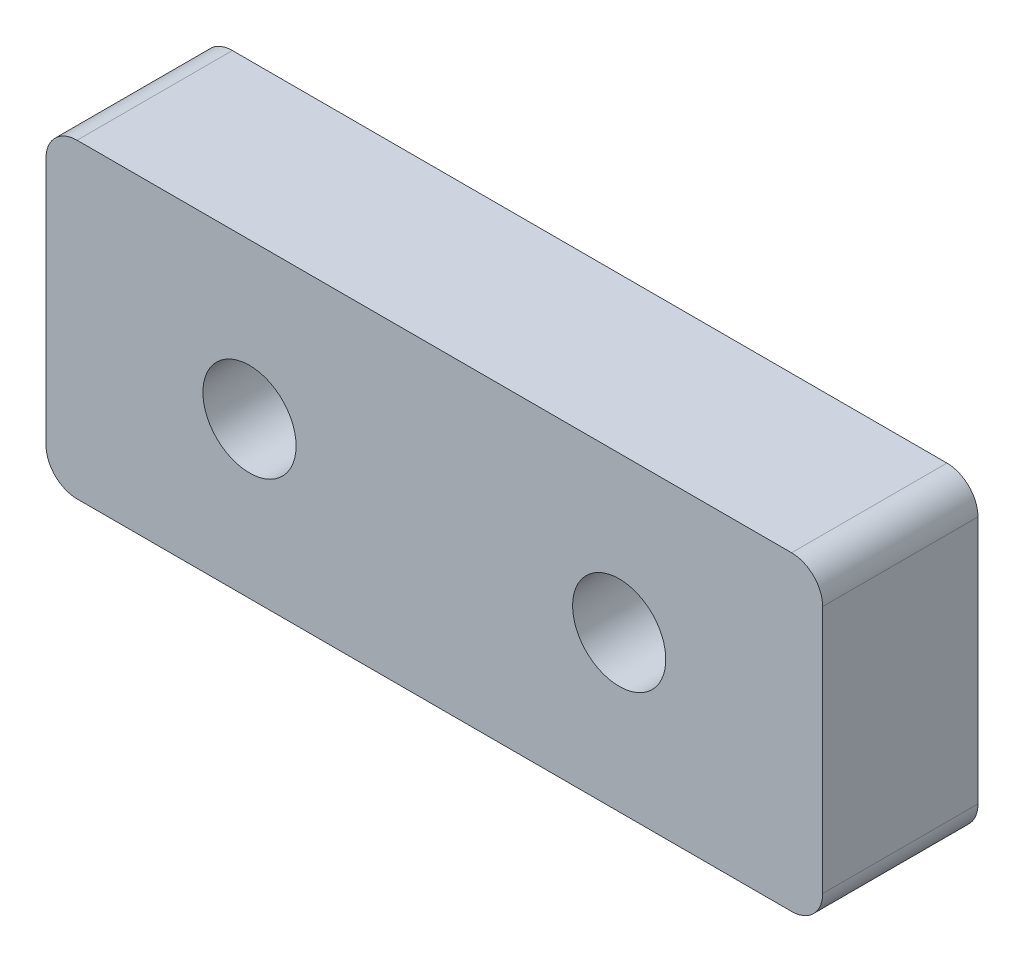
ISO-10303-21;
HEADER;
FILE_DESCRIPTION(('STEP AP214'),'2;1');
FILE_NAME('part.step','',(''),(''),'','','');
FILE_SCHEMA(('AUTOMOTIVE_DESIGN { 1 0 10303 214 1 1 1 1 }'));
ENDSEC;
DATA;
#1=APPLICATION_CONTEXT('core data for automotive mechanical design processes');
#2=APPLICATION_PROTOCOL_DEFINITION('international standard','automotive_design',2000,#1);
#3=PRODUCT_CONTEXT('',#1,'mechanical');
#4=PRODUCT('Part','Part','',(#3));
#5=PRODUCT_RELATED_PRODUCT_CATEGORY('part','',(#4));
#6=PRODUCT_DEFINITION_FORMATION('','',#4);
#7=PRODUCT_DEFINITION_CONTEXT('part definition',#1,'design');
#8=PRODUCT_DEFINITION('design','',#6,#7);
#9=PRODUCT_DEFINITION_SHAPE('','',#8);
#10=(LENGTH_UNIT() NAMED_UNIT(*) SI_UNIT(.MILLI.,.METRE.));
#11=(NAMED_UNIT(*) PLANE_ANGLE_UNIT() SI_UNIT($,.RADIAN.));
#12=(NAMED_UNIT(*) SI_UNIT($,.STERADIAN.) SOLID_ANGLE_UNIT());
#13=UNCERTAINTY_MEASURE_WITH_UNIT(LENGTH_MEASURE(1.E-05),#10,'distance_accuracy_value','');
#14=(GEOMETRIC_REPRESENTATION_CONTEXT(3) GLOBAL_UNCERTAINTY_ASSIGNED_CONTEXT((#13)) GLOBAL_UNIT_ASSIGNED_CONTEXT((#10,
#11,#12)) REPRESENTATION_CONTEXT('',''));
#15=CARTESIAN_POINT('',(0.,0.,0.));
#16=DIRECTION('',(0.,0.,1.));
#17=DIRECTION('',(1.,0.,0.));
#18=AXIS2_PLACEMENT_3D('',#15,#16,#17);
#19=CARTESIAN_POINT('',(0.,0.,5.));
#20=DIRECTION('',(0.,0.,-1.));
#21=DIRECTION('',(-1.,0.,0.));
#22=AXIS2_PLACEMENT_3D('',#19,#20,#21);
#23=PLANE('',#22);
#24=DIRECTION('',(0.,1.,0.));
#25=VECTOR('',#24,1.);
#26=CARTESIAN_POINT('',(12.5,-5.,5.));
#27=LINE('',#26,#25);
#28=CARTESIAN_POINT('',(12.5,-4.,5.));
#29=VERTEX_POINT('',#28);
#30=CARTESIAN_POINT('',(12.5,4.,5.));
#31=VERTEX_POINT('',#30);
#32=EDGE_CURVE('E142',#29,#31,#27,.T.);
#33=ORIENTED_EDGE('',*,*,#32,.T.);
#34=CARTESIAN_POINT('',(11.5,4.,5.));
#35=DIRECTION('',(0.,0.,-1.));
#36=DIRECTION('',(-1.,0.,0.));
#37=AXIS2_PLACEMENT_3D('',#34,#35,#36);
#38=CIRCLE('',#37,1.);
#39=CARTESIAN_POINT('',(11.5,5.,5.));
#40=VERTEX_POINT('',#39);
#41=EDGE_CURVE('E157',#31,#40,#38,.F.);
#42=ORIENTED_EDGE('',*,*,#41,.T.);
#43=DIRECTION('',(-1.,0.,0.));
#44=VECTOR('',#43,1.);
#45=CARTESIAN_POINT('',(-12.5,5.00000000000001,5.));
#46=LINE('',#45,#44);
#47=CARTESIAN_POINT('',(-11.5,5.00000000000001,5.));
#48=VERTEX_POINT('',#47);
#49=EDGE_CURVE('E124',#40,#48,#46,.T.);
#50=ORIENTED_EDGE('',*,*,#49,.T.);
#51=CARTESIAN_POINT('',(-11.5,4.00000000000001,5.));
#52=DIRECTION('',(0.,0.,-1.));
#53=DIRECTION('',(-1.,0.,0.));
#54=AXIS2_PLACEMENT_3D('',#51,#52,#53);
#55=CIRCLE('',#54,1.);
#56=CARTESIAN_POINT('',(-12.5,4.00000000000001,5.));
#57=VERTEX_POINT('',#56);
#58=EDGE_CURVE('E152',#48,#57,#55,.F.);
#59=ORIENTED_EDGE('',*,*,#58,.T.);
#60=DIRECTION('',(0.,-1.,0.));
#61=VECTOR('',#60,1.);
#62=CARTESIAN_POINT('',(-12.5,-4.99999999999999,5.));
#63=LINE('',#62,#61);
#64=CARTESIAN_POINT('',(-12.5,-3.99999999999999,5.));
#65=VERTEX_POINT('',#64);
#66=EDGE_CURVE('E168',#57,#65,#63,.T.);
#67=ORIENTED_EDGE('',*,*,#66,.T.);
#68=CARTESIAN_POINT('',(-11.5,-3.99999999999999,5.));
#69=DIRECTION('',(0.,0.,-1.));
#70=DIRECTION('',(-1.,0.,0.));
#71=AXIS2_PLACEMENT_3D('',#68,#69,#70);
#72=CIRCLE('',#71,1.);
#73=CARTESIAN_POINT('',(-11.5,-4.99999999999999,5.));
#74=VERTEX_POINT('',#73);
#75=EDGE_CURVE('E60',#65,#74,#72,.F.);
#76=ORIENTED_EDGE('',*,*,#75,.T.);
#77=DIRECTION('',(1.,0.,0.));
#78=VECTOR('',#77,1.);
#79=CARTESIAN_POINT('',(-12.5,-4.99999999999999,5.));
#80=LINE('',#79,#78);
#81=CARTESIAN_POINT('',(11.5,-5.,5.));
#82=VERTEX_POINT('',#81);
#83=EDGE_CURVE('E143',#74,#82,#80,.T.);
#84=ORIENTED_EDGE('',*,*,#83,.T.);
#85=CARTESIAN_POINT('',(11.5,-4.,5.));
#86=DIRECTION('',(0.,0.,-1.));
#87=DIRECTION('',(-1.,0.,0.));
#88=AXIS2_PLACEMENT_3D('',#85,#86,#87);
#89=CIRCLE('',#88,1.);
#90=EDGE_CURVE('E155',#82,#29,#89,.F.);
#91=ORIENTED_EDGE('',*,*,#90,.T.);
#92=EDGE_LOOP('',(#33,#42,#50,#59,#67,#76,#84,#91));
#93=FACE_BOUND('',#92,.T.);
#94=CARTESIAN_POINT('',(-5.95,0.,5.));
#95=DIRECTION('',(0.,0.,1.));
#96=DIRECTION('',(1.,0.,0.));
#97=AXIS2_PLACEMENT_3D('',#94,#95,#96);
#98=CIRCLE('',#97,1.5);
#99=CARTESIAN_POINT('',(-4.45,0.,5.));
#100=VERTEX_POINT('',#99);
#101=EDGE_CURVE('E137',#100,#100,#98,.T.);
#102=ORIENTED_EDGE('',*,*,#101,.F.);
#103=EDGE_LOOP('',(#102));
#104=FACE_BOUND('',#103,.T.);
#105=CARTESIAN_POINT('',(5.95,0.,5.));
#106=DIRECTION('',(0.,0.,1.));
#107=DIRECTION('',(-1.,0.,0.));
#108=AXIS2_PLACEMENT_3D('',#105,#106,#107);
#109=CIRCLE('',#108,1.5);
#110=CARTESIAN_POINT('',(4.45,0.,5.));
#111=VERTEX_POINT('',#110);
#112=EDGE_CURVE('E185',#111,#111,#109,.T.);
#113=ORIENTED_EDGE('',*,*,#112,.F.);
#114=EDGE_LOOP('',(#113));
#115=FACE_BOUND('',#114,.T.);
#116=ADVANCED_FACE('F38',(#93,#104,#115),#23,.F.);
#117=CARTESIAN_POINT('',(0.,0.,0.));
#118=DIRECTION('',(0.,0.,-1.));
#119=DIRECTION('',(-1.,0.,0.));
#120=AXIS2_PLACEMENT_3D('',#117,#118,#119);
#121=PLANE('',#120);
#122=CARTESIAN_POINT('',(-5.95,0.,0.));
#123=DIRECTION('',(0.,0.,1.));
#124=DIRECTION('',(1.,0.,0.));
#125=AXIS2_PLACEMENT_3D('',#122,#123,#124);
#126=CIRCLE('',#125,1.5);
#127=CARTESIAN_POINT('',(-4.45,0.,0.));
#128=VERTEX_POINT('',#127);
#129=EDGE_CURVE('E182',#128,#128,#126,.T.);
#130=ORIENTED_EDGE('',*,*,#129,.T.);
#131=EDGE_LOOP('',(#130));
#132=FACE_BOUND('',#131,.T.);
#133=DIRECTION('',(-1.,0.,0.));
#134=VECTOR('',#133,1.);
#135=CARTESIAN_POINT('',(-12.5,5.00000000000001,0.));
#136=LINE('',#135,#134);
#137=CARTESIAN_POINT('',(11.5,5.,0.));
#138=VERTEX_POINT('',#137);
#139=CARTESIAN_POINT('',(-11.5,5.00000000000001,0.));
#140=VERTEX_POINT('',#139);
#141=EDGE_CURVE('E121',#138,#140,#136,.T.);
#142=ORIENTED_EDGE('',*,*,#141,.F.);
#143=CARTESIAN_POINT('',(11.5,4.,0.));
#144=DIRECTION('',(0.,0.,-1.));
#145=DIRECTION('',(-1.,0.,0.));
#146=AXIS2_PLACEMENT_3D('',#143,#144,#145);
#147=CIRCLE('',#146,1.);
#148=CARTESIAN_POINT('',(12.5,4.,0.));
#149=VERTEX_POINT('',#148);
#150=EDGE_CURVE('E104',#138,#149,#147,.T.);
#151=ORIENTED_EDGE('',*,*,#150,.T.);
#152=DIRECTION('',(0.,1.,0.));
#153=VECTOR('',#152,1.);
#154=CARTESIAN_POINT('',(12.5,-5.,0.));
#155=LINE('',#154,#153);
#156=CARTESIAN_POINT('',(12.5,-4.,0.));
#157=VERTEX_POINT('',#156);
#158=EDGE_CURVE('E132',#157,#149,#155,.T.);
#159=ORIENTED_EDGE('',*,*,#158,.F.);
#160=CARTESIAN_POINT('',(11.5,-4.,0.));
#161=DIRECTION('',(0.,0.,-1.));
#162=DIRECTION('',(-1.,0.,0.));
#163=AXIS2_PLACEMENT_3D('',#160,#161,#162);
#164=CIRCLE('',#163,1.);
#165=CARTESIAN_POINT('',(11.5,-5.,0.));
#166=VERTEX_POINT('',#165);
#167=EDGE_CURVE('E115',#157,#166,#164,.T.);
#168=ORIENTED_EDGE('',*,*,#167,.T.);
#169=DIRECTION('',(1.,0.,0.));
#170=VECTOR('',#169,1.);
#171=CARTESIAN_POINT('',(-12.5,-4.99999999999999,0.));
#172=LINE('',#171,#170);
#173=CARTESIAN_POINT('',(-11.5,-4.99999999999999,0.));
#174=VERTEX_POINT('',#173);
#175=EDGE_CURVE('E135',#174,#166,#172,.T.);
#176=ORIENTED_EDGE('',*,*,#175,.F.);
#177=CARTESIAN_POINT('',(-11.5,-3.99999999999999,0.));
#178=DIRECTION('',(0.,0.,-1.));
#179=DIRECTION('',(-1.,0.,0.));
#180=AXIS2_PLACEMENT_3D('',#177,#178,#179);
#181=CIRCLE('',#180,1.);
#182=CARTESIAN_POINT('',(-12.5,-3.99999999999999,0.));
#183=VERTEX_POINT('',#182);
#184=EDGE_CURVE('E146',#174,#183,#181,.T.);
#185=ORIENTED_EDGE('',*,*,#184,.T.);
#186=DIRECTION('',(0.,-1.,0.));
#187=VECTOR('',#186,1.);
#188=CARTESIAN_POINT('',(-12.5,-4.99999999999999,0.));
#189=LINE('',#188,#187);
#190=CARTESIAN_POINT('',(-12.5,4.00000000000001,0.));
#191=VERTEX_POINT('',#190);
#192=EDGE_CURVE('E131',#191,#183,#189,.T.);
#193=ORIENTED_EDGE('',*,*,#192,.F.);
#194=CARTESIAN_POINT('',(-11.5,4.00000000000001,0.));
#195=DIRECTION('',(0.,0.,-1.));
#196=DIRECTION('',(-1.,0.,0.));
#197=AXIS2_PLACEMENT_3D('',#194,#195,#196);
#198=CIRCLE('',#197,1.);
#199=EDGE_CURVE('E125',#191,#140,#198,.T.);
#200=ORIENTED_EDGE('',*,*,#199,.T.);
#201=EDGE_LOOP('',(#142,#151,#159,#168,#176,#185,#193,#200));
#202=FACE_BOUND('',#201,.T.);
#203=CARTESIAN_POINT('',(5.95,0.,0.));
#204=DIRECTION('',(0.,0.,1.));
#205=DIRECTION('',(-1.,0.,0.));
#206=AXIS2_PLACEMENT_3D('',#203,#204,#205);
#207=CIRCLE('',#206,1.5);
#208=CARTESIAN_POINT('',(4.45,0.,0.));
#209=VERTEX_POINT('',#208);
#210=EDGE_CURVE('E188',#209,#209,#207,.T.);
#211=ORIENTED_EDGE('',*,*,#210,.T.);
#212=EDGE_LOOP('',(#211));
#213=FACE_BOUND('',#212,.T.);
#214=ADVANCED_FACE('F128',(#132,#202,#213),#121,.T.);
#215=CARTESIAN_POINT('',(12.5,-5.,5.));
#216=DIRECTION('',(-1.,0.,0.));
#217=DIRECTION('',(0.,-1.,0.));
#218=AXIS2_PLACEMENT_3D('',#215,#216,#217);
#219=PLANE('',#218);
#220=ORIENTED_EDGE('',*,*,#158,.T.);
#221=DIRECTION('',(0.,0.,-1.));
#222=VECTOR('',#221,1.);
#223=CARTESIAN_POINT('',(12.5,4.,5.));
#224=LINE('',#223,#222);
#225=EDGE_CURVE('E109',#149,#31,#224,.F.);
#226=ORIENTED_EDGE('',*,*,#225,.T.);
#227=ORIENTED_EDGE('',*,*,#32,.F.);
#228=DIRECTION('',(0.,0.,-1.));
#229=VECTOR('',#228,1.);
#230=CARTESIAN_POINT('',(12.5,-4.,5.));
#231=LINE('',#230,#229);
#232=EDGE_CURVE('E114',#29,#157,#231,.T.);
#233=ORIENTED_EDGE('',*,*,#232,.T.);
#234=EDGE_LOOP('',(#220,#226,#227,#233));
#235=FACE_BOUND('',#234,.T.);
#236=ADVANCED_FACE('F203',(#235),#219,.F.);
#237=CARTESIAN_POINT('',(-12.5,5.00000000000001,5.));
#238=DIRECTION('',(0.,-1.,0.));
#239=DIRECTION('',(1.,0.,0.));
#240=AXIS2_PLACEMENT_3D('',#237,#238,#239);
#241=PLANE('',#240);
#242=ORIENTED_EDGE('',*,*,#49,.F.);
#243=DIRECTION('',(0.,0.,-1.));
#244=VECTOR('',#243,1.);
#245=CARTESIAN_POINT('',(11.5,5.,5.));
#246=LINE('',#245,#244);
#247=EDGE_CURVE('E108',#40,#138,#246,.T.);
#248=ORIENTED_EDGE('',*,*,#247,.T.);
#249=ORIENTED_EDGE('',*,*,#141,.T.);
#250=DIRECTION('',(0.,0.,-1.));
#251=VECTOR('',#250,1.);
#252=CARTESIAN_POINT('',(-11.5,5.00000000000001,5.));
#253=LINE('',#252,#251);
#254=EDGE_CURVE('E126',#140,#48,#253,.F.);
#255=ORIENTED_EDGE('',*,*,#254,.T.);
#256=EDGE_LOOP('',(#242,#248,#249,#255));
#257=FACE_BOUND('',#256,.T.);
#258=ADVANCED_FACE('F120',(#257),#241,.F.);
#259=CARTESIAN_POINT('',(-12.5,-4.99999999999999,5.));
#260=DIRECTION('',(1.,0.,0.));
#261=DIRECTION('',(0.,1.,0.));
#262=AXIS2_PLACEMENT_3D('',#259,#260,#261);
#263=PLANE('',#262);
#264=ORIENTED_EDGE('',*,*,#192,.T.);
#265=DIRECTION('',(0.,0.,-1.));
#266=VECTOR('',#265,1.);
#267=CARTESIAN_POINT('',(-12.5,-3.99999999999999,5.));
#268=LINE('',#267,#266);
#269=EDGE_CURVE('E11',#183,#65,#268,.F.);
#270=ORIENTED_EDGE('',*,*,#269,.T.);
#271=ORIENTED_EDGE('',*,*,#66,.F.);
#272=DIRECTION('',(0.,0.,-1.));
#273=VECTOR('',#272,1.);
#274=CARTESIAN_POINT('',(-12.5,4.00000000000001,5.));
#275=LINE('',#274,#273);
#276=EDGE_CURVE('E46',#57,#191,#275,.T.);
#277=ORIENTED_EDGE('',*,*,#276,.T.);
#278=EDGE_LOOP('',(#264,#270,#271,#277));
#279=FACE_BOUND('',#278,.T.);
#280=ADVANCED_FACE('F166',(#279),#263,.F.);
#281=CARTESIAN_POINT('',(-12.5,-4.99999999999999,5.));
#282=DIRECTION('',(0.,1.,0.));
#283=DIRECTION('',(-1.,0.,0.));
#284=AXIS2_PLACEMENT_3D('',#281,#282,#283);
#285=PLANE('',#284);
#286=ORIENTED_EDGE('',*,*,#175,.T.);
#287=DIRECTION('',(0.,0.,-1.));
#288=VECTOR('',#287,1.);
#289=CARTESIAN_POINT('',(11.5,-5.,5.));
#290=LINE('',#289,#288);
#291=EDGE_CURVE('E53',#166,#82,#290,.F.);
#292=ORIENTED_EDGE('',*,*,#291,.T.);
#293=ORIENTED_EDGE('',*,*,#83,.F.);
#294=DIRECTION('',(0.,0.,-1.));
#295=VECTOR('',#294,1.);
#296=CARTESIAN_POINT('',(-11.5,-4.99999999999999,5.));
#297=LINE('',#296,#295);
#298=EDGE_CURVE('E159',#74,#174,#297,.T.);
#299=ORIENTED_EDGE('',*,*,#298,.T.);
#300=EDGE_LOOP('',(#286,#292,#293,#299));
#301=FACE_BOUND('',#300,.T.);
#302=ADVANCED_FACE('F175',(#301),#285,.F.);
#303=CARTESIAN_POINT('',(-5.95,0.,5.));
#304=DIRECTION('',(0.,0.,-1.));
#305=DIRECTION('',(-1.,0.,0.));
#306=AXIS2_PLACEMENT_3D('',#303,#304,#305);
#307=CYLINDRICAL_SURFACE('',#306,1.5);
#308=ORIENTED_EDGE('',*,*,#101,.T.);
#309=EDGE_LOOP('',(#308));
#310=FACE_BOUND('',#309,.T.);
#311=ORIENTED_EDGE('',*,*,#129,.F.);
#312=EDGE_LOOP('',(#311));
#313=FACE_BOUND('',#312,.T.);
#314=ADVANCED_FACE('F208',(#310,#313),#307,.F.);
#315=CARTESIAN_POINT('',(5.95,0.,5.));
#316=DIRECTION('',(0.,0.,-1.));
#317=DIRECTION('',(-1.,0.,0.));
#318=AXIS2_PLACEMENT_3D('',#315,#316,#317);
#319=CYLINDRICAL_SURFACE('',#318,1.5);
#320=ORIENTED_EDGE('',*,*,#112,.T.);
#321=EDGE_LOOP('',(#320));
#322=FACE_BOUND('',#321,.T.);
#323=ORIENTED_EDGE('',*,*,#210,.F.);
#324=EDGE_LOOP('',(#323));
#325=FACE_BOUND('',#324,.T.);
#326=ADVANCED_FACE('F194',(#322,#325),#319,.F.);
#327=CARTESIAN_POINT('',(11.5,4.,5.));
#328=DIRECTION('',(0.,0.,-1.));
#329=DIRECTION('',(-1.,0.,0.));
#330=AXIS2_PLACEMENT_3D('',#327,#328,#329);
#331=CYLINDRICAL_SURFACE('',#330,1.);
#332=ORIENTED_EDGE('',*,*,#41,.F.);
#333=ORIENTED_EDGE('',*,*,#225,.F.);
#334=ORIENTED_EDGE('',*,*,#150,.F.);
#335=ORIENTED_EDGE('',*,*,#247,.F.);
#336=EDGE_LOOP('',(#332,#333,#334,#335));
#337=FACE_BOUND('',#336,.T.);
#338=ADVANCED_FACE('F107',(#337),#331,.T.);
#339=CARTESIAN_POINT('',(11.5,-4.,5.));
#340=DIRECTION('',(0.,0.,-1.));
#341=DIRECTION('',(-1.,0.,0.));
#342=AXIS2_PLACEMENT_3D('',#339,#340,#341);
#343=CYLINDRICAL_SURFACE('',#342,1.);
#344=ORIENTED_EDGE('',*,*,#90,.F.);
#345=ORIENTED_EDGE('',*,*,#291,.F.);
#346=ORIENTED_EDGE('',*,*,#167,.F.);
#347=ORIENTED_EDGE('',*,*,#232,.F.);
#348=EDGE_LOOP('',(#344,#345,#346,#347));
#349=FACE_BOUND('',#348,.T.);
#350=ADVANCED_FACE('F222',(#349),#343,.T.);
#351=CARTESIAN_POINT('',(-11.5,-3.99999999999999,5.));
#352=DIRECTION('',(0.,0.,-1.));
#353=DIRECTION('',(-1.,0.,0.));
#354=AXIS2_PLACEMENT_3D('',#351,#352,#353);
#355=CYLINDRICAL_SURFACE('',#354,1.);
#356=ORIENTED_EDGE('',*,*,#75,.F.);
#357=ORIENTED_EDGE('',*,*,#269,.F.);
#358=ORIENTED_EDGE('',*,*,#184,.F.);
#359=ORIENTED_EDGE('',*,*,#298,.F.);
#360=EDGE_LOOP('',(#356,#357,#358,#359));
#361=FACE_BOUND('',#360,.T.);
#362=ADVANCED_FACE('F174',(#361),#355,.T.);
#363=CARTESIAN_POINT('',(-11.5,4.00000000000001,5.));
#364=DIRECTION('',(0.,0.,-1.));
#365=DIRECTION('',(-1.,0.,0.));
#366=AXIS2_PLACEMENT_3D('',#363,#364,#365);
#367=CYLINDRICAL_SURFACE('',#366,1.);
#368=ORIENTED_EDGE('',*,*,#58,.F.);
#369=ORIENTED_EDGE('',*,*,#254,.F.);
#370=ORIENTED_EDGE('',*,*,#199,.F.);
#371=ORIENTED_EDGE('',*,*,#276,.F.);
#372=EDGE_LOOP('',(#368,#369,#370,#371));
#373=FACE_BOUND('',#372,.T.);
#374=ADVANCED_FACE('F40',(#373),#367,.T.);
#375=CLOSED_SHELL('',(#116,#214,#236,#258,#280,#302,#314,#326,#338,#350,#362,#374));
#376=MANIFOLD_SOLID_BREP('B2',#375);
#377=ADVANCED_BREP_SHAPE_REPRESENTATION('',(#18,#376),#14);
#378=SHAPE_DEFINITION_REPRESENTATION(#9,#377);
ENDSEC;
END-ISO-10303-21;
